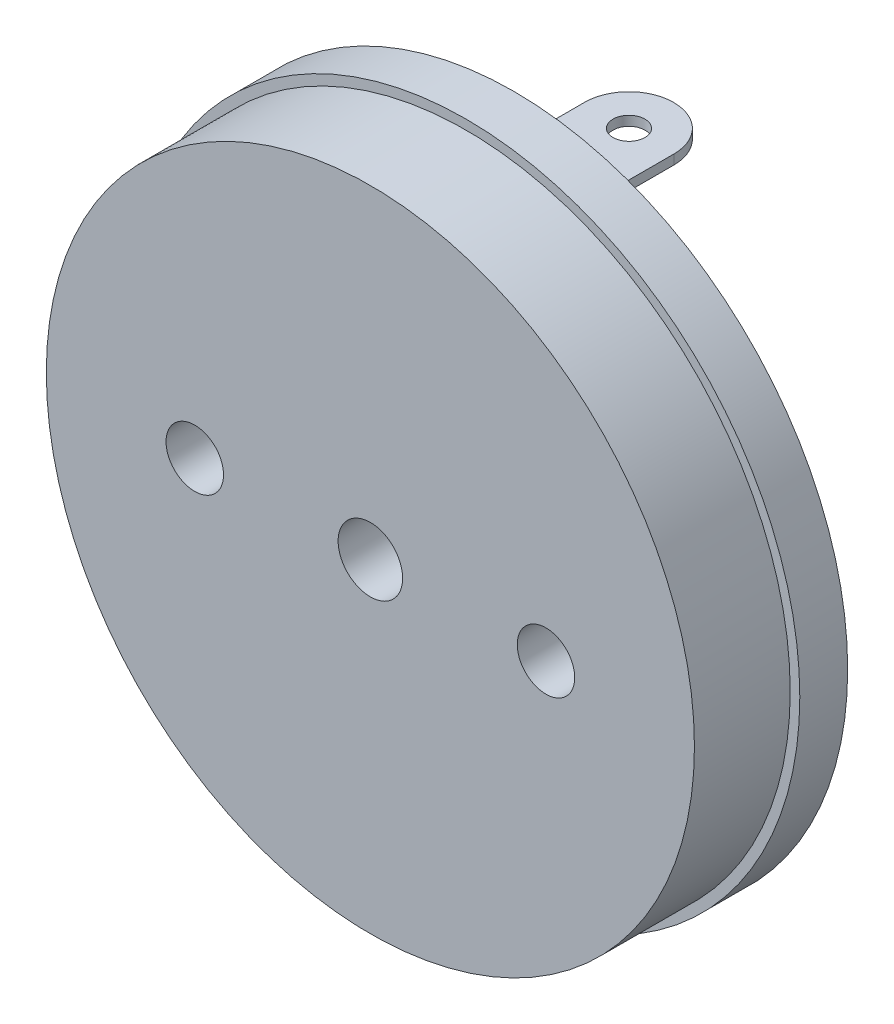
ISO-10303-21;
HEADER;
FILE_DESCRIPTION(('STEP AP214'),'2;1');
FILE_NAME('part.step','',(''),(''),'','','');
FILE_SCHEMA(('AUTOMOTIVE_DESIGN { 1 0 10303 214 1 1 1 1 }'));
ENDSEC;
DATA;
#1=APPLICATION_CONTEXT('core data for automotive mechanical design processes');
#2=APPLICATION_PROTOCOL_DEFINITION('international standard','automotive_design',2000,#1);
#3=PRODUCT_CONTEXT('',#1,'mechanical');
#4=PRODUCT('Part','Part','',(#3));
#5=PRODUCT_RELATED_PRODUCT_CATEGORY('part','',(#4));
#6=PRODUCT_DEFINITION_FORMATION('','',#4);
#7=PRODUCT_DEFINITION_CONTEXT('part definition',#1,'design');
#8=PRODUCT_DEFINITION('design','',#6,#7);
#9=PRODUCT_DEFINITION_SHAPE('','',#8);
#10=(LENGTH_UNIT() NAMED_UNIT(*) SI_UNIT(.MILLI.,.METRE.));
#11=(NAMED_UNIT(*) PLANE_ANGLE_UNIT() SI_UNIT($,.RADIAN.));
#12=(NAMED_UNIT(*) SI_UNIT($,.STERADIAN.) SOLID_ANGLE_UNIT());
#13=UNCERTAINTY_MEASURE_WITH_UNIT(LENGTH_MEASURE(1.E-05),#10,'distance_accuracy_value','');
#14=(GEOMETRIC_REPRESENTATION_CONTEXT(3) GLOBAL_UNCERTAINTY_ASSIGNED_CONTEXT((#13)) GLOBAL_UNIT_ASSIGNED_CONTEXT((#10,
#11,#12)) REPRESENTATION_CONTEXT('',''));
#15=CARTESIAN_POINT('',(0.,0.,0.));
#16=DIRECTION('',(0.,0.,1.));
#17=DIRECTION('',(1.,0.,0.));
#18=AXIS2_PLACEMENT_3D('',#15,#16,#17);
#19=CARTESIAN_POINT('',(0.,0.,0.));
#20=DIRECTION('',(0.,0.,1.));
#21=DIRECTION('',(1.,0.,0.));
#22=AXIS2_PLACEMENT_3D('',#19,#20,#21);
#23=PLANE('',#22);
#24=DIRECTION('',(1.,0.,0.));
#25=VECTOR('',#24,1.);
#26=CARTESIAN_POINT('',(2.81635245106834,-5.66058957987012,0.));
#27=LINE('',#26,#25);
#28=CARTESIAN_POINT('',(2.81635245106833,-5.66058957987012,0.));
#29=VERTEX_POINT('',#28);
#30=CARTESIAN_POINT('',(4.93558795880297,-5.66058957987012,0.));
#31=VERTEX_POINT('',#30);
#32=EDGE_CURVE('E179',#29,#31,#27,.T.);
#33=ORIENTED_EDGE('',*,*,#32,.F.);
#34=DIRECTION('',(0.,1.,0.));
#35=VECTOR('',#34,1.);
#36=CARTESIAN_POINT('',(2.81635245106834,-7.91924847627147,0.));
#37=LINE('',#36,#35);
#38=CARTESIAN_POINT('',(2.81635245106834,-7.91924847627147,0.));
#39=VERTEX_POINT('',#38);
#40=EDGE_CURVE('E55',#39,#29,#37,.T.);
#41=ORIENTED_EDGE('',*,*,#40,.F.);
#42=DIRECTION('',(-1.,0.,0.));
#43=VECTOR('',#42,1.);
#44=CARTESIAN_POINT('',(2.81635245106834,-7.91924847627147,0.));
#45=LINE('',#44,#43);
#46=CARTESIAN_POINT('',(4.93558795880296,-7.91924847627148,0.));
#47=VERTEX_POINT('',#46);
#48=EDGE_CURVE('E185',#47,#39,#45,.T.);
#49=ORIENTED_EDGE('',*,*,#48,.F.);
#50=DIRECTION('',(0.,-1.,0.));
#51=VECTOR('',#50,1.);
#52=CARTESIAN_POINT('',(4.93558795880296,-7.91924847627148,0.));
#53=LINE('',#52,#51);
#54=EDGE_CURVE('E168',#31,#47,#53,.T.);
#55=ORIENTED_EDGE('',*,*,#54,.F.);
#56=EDGE_LOOP('',(#33,#41,#49,#55));
#57=FACE_BOUND('',#56,.T.);
#58=CARTESIAN_POINT('',(-3.62500810533549,7.08270814427097,0.));
#59=DIRECTION('',(0.,0.,-1.));
#60=DIRECTION('',(-1.,0.,0.));
#61=AXIS2_PLACEMENT_3D('',#58,#59,#60);
#62=CIRCLE('',#61,1.1292433811009);
#63=CARTESIAN_POINT('',(-4.75425148643639,7.08270814427097,0.));
#64=VERTEX_POINT('',#63);
#65=EDGE_CURVE('E201',#64,#64,#62,.T.);
#66=ORIENTED_EDGE('',*,*,#65,.F.);
#67=EDGE_LOOP('',(#66));
#68=FACE_BOUND('',#67,.T.);
#69=DIRECTION('',(-1.,0.,0.));
#70=VECTOR('',#69,1.);
#71=CARTESIAN_POINT('',(1.4,-7.65,0.));
#72=LINE('',#71,#70);
#73=CARTESIAN_POINT('',(1.4,-7.65,0.));
#74=VERTEX_POINT('',#73);
#75=CARTESIAN_POINT('',(-1.4,-7.65,0.));
#76=VERTEX_POINT('',#75);
#77=EDGE_CURVE('E247',#74,#76,#72,.T.);
#78=ORIENTED_EDGE('',*,*,#77,.F.);
#79=DIRECTION('',(0.,-1.,0.));
#80=VECTOR('',#79,1.);
#81=CARTESIAN_POINT('',(1.4,-7.65,0.));
#82=LINE('',#81,#80);
#83=CARTESIAN_POINT('',(1.4,-7.35,0.));
#84=VERTEX_POINT('',#83);
#85=EDGE_CURVE('E256',#84,#74,#82,.T.);
#86=ORIENTED_EDGE('',*,*,#85,.F.);
#87=DIRECTION('',(1.,0.,0.));
#88=VECTOR('',#87,1.);
#89=CARTESIAN_POINT('',(1.4,-7.35,0.));
#90=LINE('',#89,#88);
#91=CARTESIAN_POINT('',(-1.4,-7.35,0.));
#92=VERTEX_POINT('',#91);
#93=EDGE_CURVE('E253',#92,#84,#90,.T.);
#94=ORIENTED_EDGE('',*,*,#93,.F.);
#95=DIRECTION('',(0.,1.,0.));
#96=VECTOR('',#95,1.);
#97=CARTESIAN_POINT('',(-1.4,-7.65,0.));
#98=LINE('',#97,#96);
#99=EDGE_CURVE('E250',#76,#92,#98,.T.);
#100=ORIENTED_EDGE('',*,*,#99,.F.);
#101=EDGE_LOOP('',(#78,#86,#94,#100));
#102=FACE_BOUND('',#101,.T.);
#103=CARTESIAN_POINT('',(0.,0.,0.));
#104=DIRECTION('',(0.,0.,1.));
#105=DIRECTION('',(1.,0.,0.));
#106=AXIS2_PLACEMENT_3D('',#103,#104,#105);
#107=CIRCLE('',#106,10.45);
#108=CARTESIAN_POINT('',(10.45,0.,0.));
#109=VERTEX_POINT('',#108);
#110=EDGE_CURVE('E314',#109,#109,#107,.T.);
#111=ORIENTED_EDGE('',*,*,#110,.F.);
#112=EDGE_LOOP('',(#111));
#113=FACE_BOUND('',#112,.T.);
#114=CARTESIAN_POINT('',(-5.5,0.,0.));
#115=DIRECTION('',(0.,0.,1.));
#116=DIRECTION('',(1.,0.,0.));
#117=AXIS2_PLACEMENT_3D('',#114,#115,#116);
#118=CIRCLE('',#117,0.899999999999999);
#119=CARTESIAN_POINT('',(-4.6,0.,0.));
#120=VERTEX_POINT('',#119);
#121=EDGE_CURVE('E305',#120,#120,#118,.T.);
#122=ORIENTED_EDGE('',*,*,#121,.T.);
#123=EDGE_LOOP('',(#122));
#124=FACE_BOUND('',#123,.T.);
#125=CARTESIAN_POINT('',(5.5,0.,0.));
#126=DIRECTION('',(0.,0.,1.));
#127=DIRECTION('',(-1.,0.,0.));
#128=AXIS2_PLACEMENT_3D('',#125,#126,#127);
#129=CIRCLE('',#128,0.899999999999999);
#130=CARTESIAN_POINT('',(4.6,0.,0.));
#131=VERTEX_POINT('',#130);
#132=EDGE_CURVE('E299',#131,#131,#129,.T.);
#133=ORIENTED_EDGE('',*,*,#132,.T.);
#134=EDGE_LOOP('',(#133));
#135=FACE_BOUND('',#134,.T.);
#136=CARTESIAN_POINT('',(0.,0.,0.));
#137=DIRECTION('',(0.,0.,-1.));
#138=DIRECTION('',(-1.,0.,0.));
#139=AXIS2_PLACEMENT_3D('',#136,#137,#138);
#140=CIRCLE('',#139,3.08);
#141=CARTESIAN_POINT('',(-2.3279941084415,2.01664162187079,0.));
#142=VERTEX_POINT('',#141);
#143=CARTESIAN_POINT('',(-2.3279941084415,-2.01664162187079,0.));
#144=VERTEX_POINT('',#143);
#145=EDGE_CURVE('E279',#142,#144,#140,.T.);
#146=ORIENTED_EDGE('',*,*,#145,.F.);
#147=DIRECTION('',(0.,1.,0.));
#148=VECTOR('',#147,1.);
#149=CARTESIAN_POINT('',(-2.3279941084415,2.01664162187079,0.));
#150=LINE('',#149,#148);
#151=EDGE_CURVE('E282',#144,#142,#150,.T.);
#152=ORIENTED_EDGE('',*,*,#151,.F.);
#153=EDGE_LOOP('',(#146,#152));
#154=FACE_BOUND('',#153,.T.);
#155=DIRECTION('',(0.,-1.,0.));
#156=VECTOR('',#155,1.);
#157=CARTESIAN_POINT('',(1.4,7.65,0.));
#158=LINE('',#157,#156);
#159=CARTESIAN_POINT('',(1.4,7.65,0.));
#160=VERTEX_POINT('',#159);
#161=CARTESIAN_POINT('',(1.4,7.35,0.));
#162=VERTEX_POINT('',#161);
#163=EDGE_CURVE('E221',#160,#162,#158,.T.);
#164=ORIENTED_EDGE('',*,*,#163,.F.);
#165=DIRECTION('',(1.,0.,0.));
#166=VECTOR('',#165,1.);
#167=CARTESIAN_POINT('',(1.4,7.65,0.));
#168=LINE('',#167,#166);
#169=CARTESIAN_POINT('',(-1.4,7.65,0.));
#170=VERTEX_POINT('',#169);
#171=EDGE_CURVE('E230',#170,#160,#168,.T.);
#172=ORIENTED_EDGE('',*,*,#171,.F.);
#173=DIRECTION('',(0.,1.,0.));
#174=VECTOR('',#173,1.);
#175=CARTESIAN_POINT('',(-1.4,7.65,0.));
#176=LINE('',#175,#174);
#177=CARTESIAN_POINT('',(-1.4,7.35,0.));
#178=VERTEX_POINT('',#177);
#179=EDGE_CURVE('E227',#178,#170,#176,.T.);
#180=ORIENTED_EDGE('',*,*,#179,.F.);
#181=DIRECTION('',(-1.,0.,0.));
#182=VECTOR('',#181,1.);
#183=CARTESIAN_POINT('',(1.4,7.35,0.));
#184=LINE('',#183,#182);
#185=EDGE_CURVE('E224',#162,#178,#184,.T.);
#186=ORIENTED_EDGE('',*,*,#185,.F.);
#187=EDGE_LOOP('',(#164,#172,#180,#186));
#188=FACE_BOUND('',#187,.T.);
#189=ADVANCED_FACE('F40',(#57,#68,#102,#113,#124,#135,#154,#188),#23,.F.);
#190=CARTESIAN_POINT('',(0.,0.,1.5));
#191=DIRECTION('',(0.,0.,1.));
#192=DIRECTION('',(1.,0.,0.));
#193=AXIS2_PLACEMENT_3D('',#190,#191,#192);
#194=PLANE('',#193);
#195=CARTESIAN_POINT('',(0.,0.,1.5));
#196=DIRECTION('',(0.,0.,1.));
#197=DIRECTION('',(1.,0.,0.));
#198=AXIS2_PLACEMENT_3D('',#195,#196,#197);
#199=CIRCLE('',#198,10.45);
#200=CARTESIAN_POINT('',(10.45,0.,1.5));
#201=VERTEX_POINT('',#200);
#202=EDGE_CURVE('E317',#201,#201,#199,.T.);
#203=ORIENTED_EDGE('',*,*,#202,.T.);
#204=EDGE_LOOP('',(#203));
#205=FACE_BOUND('',#204,.T.);
#206=CARTESIAN_POINT('',(0.,0.,1.5));
#207=DIRECTION('',(0.,0.,1.));
#208=DIRECTION('',(1.,0.,0.));
#209=AXIS2_PLACEMENT_3D('',#206,#207,#208);
#210=CIRCLE('',#209,10.15);
#211=CARTESIAN_POINT('',(10.15,0.,1.5));
#212=VERTEX_POINT('',#211);
#213=EDGE_CURVE('E308',#212,#212,#210,.T.);
#214=ORIENTED_EDGE('',*,*,#213,.F.);
#215=EDGE_LOOP('',(#214));
#216=FACE_BOUND('',#215,.T.);
#217=ADVANCED_FACE('F392',(#205,#216),#194,.T.);
#218=CARTESIAN_POINT('',(0.,0.,1.5));
#219=DIRECTION('',(0.,0.,-1.));
#220=DIRECTION('',(-1.,0.,0.));
#221=AXIS2_PLACEMENT_3D('',#218,#219,#220);
#222=CYLINDRICAL_SURFACE('',#221,10.45);
#223=ORIENTED_EDGE('',*,*,#202,.F.);
#224=EDGE_LOOP('',(#223));
#225=FACE_BOUND('',#224,.T.);
#226=ORIENTED_EDGE('',*,*,#110,.T.);
#227=EDGE_LOOP('',(#226));
#228=FACE_BOUND('',#227,.T.);
#229=ADVANCED_FACE('F42',(#225,#228),#222,.T.);
#230=CARTESIAN_POINT('',(0.,0.,4.5));
#231=DIRECTION('',(0.,0.,-1.));
#232=DIRECTION('',(-1.,0.,0.));
#233=AXIS2_PLACEMENT_3D('',#230,#231,#232);
#234=CYLINDRICAL_SURFACE('',#233,10.15);
#235=CARTESIAN_POINT('',(0.,0.,4.5));
#236=DIRECTION('',(0.,0.,1.));
#237=DIRECTION('',(1.,0.,0.));
#238=AXIS2_PLACEMENT_3D('',#235,#236,#237);
#239=CIRCLE('',#238,10.15);
#240=CARTESIAN_POINT('',(10.15,0.,4.5));
#241=VERTEX_POINT('',#240);
#242=EDGE_CURVE('E311',#241,#241,#239,.T.);
#243=ORIENTED_EDGE('',*,*,#242,.F.);
#244=EDGE_LOOP('',(#243));
#245=FACE_BOUND('',#244,.T.);
#246=ORIENTED_EDGE('',*,*,#213,.T.);
#247=EDGE_LOOP('',(#246));
#248=FACE_BOUND('',#247,.T.);
#249=ADVANCED_FACE('F399',(#245,#248),#234,.T.);
#250=CARTESIAN_POINT('',(0.,0.,4.5));
#251=DIRECTION('',(0.,0.,1.));
#252=DIRECTION('',(1.,0.,0.));
#253=AXIS2_PLACEMENT_3D('',#250,#251,#252);
#254=PLANE('',#253);
#255=CARTESIAN_POINT('',(0.,0.,4.5));
#256=DIRECTION('',(0.,0.,1.));
#257=DIRECTION('',(1.,0.,0.));
#258=AXIS2_PLACEMENT_3D('',#255,#256,#257);
#259=CIRCLE('',#258,1.01);
#260=CARTESIAN_POINT('',(1.01,0.,4.5));
#261=VERTEX_POINT('',#260);
#262=EDGE_CURVE('E273',#261,#261,#259,.T.);
#263=ORIENTED_EDGE('',*,*,#262,.F.);
#264=EDGE_LOOP('',(#263));
#265=FACE_BOUND('',#264,.T.);
#266=CARTESIAN_POINT('',(5.5,0.,4.5));
#267=DIRECTION('',(0.,0.,1.));
#268=DIRECTION('',(-1.,0.,0.));
#269=AXIS2_PLACEMENT_3D('',#266,#267,#268);
#270=CIRCLE('',#269,0.899999999999999);
#271=CARTESIAN_POINT('',(4.6,0.,4.5));
#272=VERTEX_POINT('',#271);
#273=EDGE_CURVE('E296',#272,#272,#270,.T.);
#274=ORIENTED_EDGE('',*,*,#273,.F.);
#275=EDGE_LOOP('',(#274));
#276=FACE_BOUND('',#275,.T.);
#277=CARTESIAN_POINT('',(-5.5,0.,4.5));
#278=DIRECTION('',(0.,0.,1.));
#279=DIRECTION('',(1.,0.,0.));
#280=AXIS2_PLACEMENT_3D('',#277,#278,#279);
#281=CIRCLE('',#280,0.899999999999999);
#282=CARTESIAN_POINT('',(-4.6,0.,4.5));
#283=VERTEX_POINT('',#282);
#284=EDGE_CURVE('E302',#283,#283,#281,.T.);
#285=ORIENTED_EDGE('',*,*,#284,.F.);
#286=EDGE_LOOP('',(#285));
#287=FACE_BOUND('',#286,.T.);
#288=ORIENTED_EDGE('',*,*,#242,.T.);
#289=EDGE_LOOP('',(#288));
#290=FACE_BOUND('',#289,.T.);
#291=ADVANCED_FACE('F402',(#265,#276,#287,#290),#254,.T.);
#292=CARTESIAN_POINT('',(-5.5,0.,0.));
#293=DIRECTION('',(0.,0.,1.));
#294=DIRECTION('',(1.,0.,0.));
#295=AXIS2_PLACEMENT_3D('',#292,#293,#294);
#296=CYLINDRICAL_SURFACE('',#295,0.899999999999999);
#297=ORIENTED_EDGE('',*,*,#121,.F.);
#298=EDGE_LOOP('',(#297));
#299=FACE_BOUND('',#298,.T.);
#300=ORIENTED_EDGE('',*,*,#284,.T.);
#301=EDGE_LOOP('',(#300));
#302=FACE_BOUND('',#301,.T.);
#303=ADVANCED_FACE('F406',(#299,#302),#296,.F.);
#304=CARTESIAN_POINT('',(5.5,0.,0.));
#305=DIRECTION('',(0.,0.,1.));
#306=DIRECTION('',(1.,0.,0.));
#307=AXIS2_PLACEMENT_3D('',#304,#305,#306);
#308=CYLINDRICAL_SURFACE('',#307,0.899999999999999);
#309=ORIENTED_EDGE('',*,*,#132,.F.);
#310=EDGE_LOOP('',(#309));
#311=FACE_BOUND('',#310,.T.);
#312=ORIENTED_EDGE('',*,*,#273,.T.);
#313=EDGE_LOOP('',(#312));
#314=FACE_BOUND('',#313,.T.);
#315=ADVANCED_FACE('F410',(#311,#314),#308,.F.);
#316=CARTESIAN_POINT('',(0.,0.,-2.));
#317=DIRECTION('',(0.,0.,1.));
#318=DIRECTION('',(1.,0.,0.));
#319=AXIS2_PLACEMENT_3D('',#316,#317,#318);
#320=CYLINDRICAL_SURFACE('',#319,3.08);
#321=ORIENTED_EDGE('',*,*,#145,.T.);
#322=DIRECTION('',(0.,0.,1.));
#323=VECTOR('',#322,1.);
#324=CARTESIAN_POINT('',(-2.3279941084415,-2.01664162187083,-2.));
#325=LINE('',#324,#323);
#326=CARTESIAN_POINT('',(-2.3279941084415,-2.01664162187083,-2.));
#327=VERTEX_POINT('',#326);
#328=EDGE_CURVE('E293',#327,#144,#325,.T.);
#329=ORIENTED_EDGE('',*,*,#328,.F.);
#330=CARTESIAN_POINT('',(0.,0.,-2.));
#331=DIRECTION('',(0.,0.,-1.));
#332=DIRECTION('',(-1.,0.,0.));
#333=AXIS2_PLACEMENT_3D('',#330,#331,#332);
#334=CIRCLE('',#333,3.08);
#335=CARTESIAN_POINT('',(-2.3279941084415,2.01664162187076,-2.));
#336=VERTEX_POINT('',#335);
#337=EDGE_CURVE('E285',#336,#327,#334,.T.);
#338=ORIENTED_EDGE('',*,*,#337,.F.);
#339=DIRECTION('',(0.,0.,1.));
#340=VECTOR('',#339,1.);
#341=CARTESIAN_POINT('',(-2.3279941084415,2.01664162187076,-2.));
#342=LINE('',#341,#340);
#343=EDGE_CURVE('E290',#336,#142,#342,.T.);
#344=ORIENTED_EDGE('',*,*,#343,.T.);
#345=EDGE_LOOP('',(#321,#329,#338,#344));
#346=FACE_BOUND('',#345,.T.);
#347=ADVANCED_FACE('F414',(#346),#320,.T.);
#348=CARTESIAN_POINT('',(-2.3279941084415,2.01664162187076,-2.));
#349=DIRECTION('',(1.,0.,0.));
#350=DIRECTION('',(0.,1.,0.));
#351=AXIS2_PLACEMENT_3D('',#348,#349,#350);
#352=PLANE('',#351);
#353=ORIENTED_EDGE('',*,*,#151,.T.);
#354=ORIENTED_EDGE('',*,*,#343,.F.);
#355=DIRECTION('',(0.,1.,0.));
#356=VECTOR('',#355,1.);
#357=CARTESIAN_POINT('',(-2.3279941084415,2.01664162187076,-2.));
#358=LINE('',#357,#356);
#359=EDGE_CURVE('E288',#327,#336,#358,.T.);
#360=ORIENTED_EDGE('',*,*,#359,.F.);
#361=ORIENTED_EDGE('',*,*,#328,.T.);
#362=EDGE_LOOP('',(#353,#354,#360,#361));
#363=FACE_BOUND('',#362,.T.);
#364=ADVANCED_FACE('F418',(#363),#352,.F.);
#365=CARTESIAN_POINT('',(0.,0.,-2.));
#366=DIRECTION('',(0.,0.,-1.));
#367=DIRECTION('',(-1.,0.,0.));
#368=AXIS2_PLACEMENT_3D('',#365,#366,#367);
#369=PLANE('',#368);
#370=CARTESIAN_POINT('',(0.,0.,-2.));
#371=DIRECTION('',(0.,0.,1.));
#372=DIRECTION('',(1.,0.,0.));
#373=AXIS2_PLACEMENT_3D('',#370,#371,#372);
#374=CIRCLE('',#373,1.01);
#375=CARTESIAN_POINT('',(1.01,0.,-2.));
#376=VERTEX_POINT('',#375);
#377=EDGE_CURVE('E276',#376,#376,#374,.T.);
#378=ORIENTED_EDGE('',*,*,#377,.T.);
#379=EDGE_LOOP('',(#378));
#380=FACE_BOUND('',#379,.T.);
#381=ORIENTED_EDGE('',*,*,#337,.T.);
#382=ORIENTED_EDGE('',*,*,#359,.T.);
#383=EDGE_LOOP('',(#381,#382));
#384=FACE_BOUND('',#383,.T.);
#385=ADVANCED_FACE('F422',(#380,#384),#369,.T.);
#386=CARTESIAN_POINT('',(0.,0.,-2.));
#387=DIRECTION('',(0.,0.,1.));
#388=DIRECTION('',(1.,0.,0.));
#389=AXIS2_PLACEMENT_3D('',#386,#387,#388);
#390=CYLINDRICAL_SURFACE('',#389,1.01);
#391=ORIENTED_EDGE('',*,*,#377,.F.);
#392=EDGE_LOOP('',(#391));
#393=FACE_BOUND('',#392,.T.);
#394=ORIENTED_EDGE('',*,*,#262,.T.);
#395=EDGE_LOOP('',(#394));
#396=FACE_BOUND('',#395,.T.);
#397=ADVANCED_FACE('F426',(#393,#396),#390,.F.);
#398=CARTESIAN_POINT('',(1.4,-7.65,-5.));
#399=DIRECTION('',(0.,1.,0.));
#400=DIRECTION('',(0.,0.,1.));
#401=AXIS2_PLACEMENT_3D('',#398,#399,#400);
#402=PLANE('',#401);
#403=CARTESIAN_POINT('',(0.,-7.65,-3.6));
#404=DIRECTION('',(0.,1.,0.));
#405=DIRECTION('',(0.,0.,1.));
#406=AXIS2_PLACEMENT_3D('',#403,#404,#405);
#407=CIRCLE('',#406,0.5);
#408=CARTESIAN_POINT('',(0.,-7.65,-3.1));
#409=VERTEX_POINT('',#408);
#410=EDGE_CURVE('E218',#409,#409,#407,.T.);
#411=ORIENTED_EDGE('',*,*,#410,.T.);
#412=EDGE_LOOP('',(#411));
#413=FACE_BOUND('',#412,.T.);
#414=DIRECTION('',(0.,0.,1.));
#415=VECTOR('',#414,1.);
#416=CARTESIAN_POINT('',(-1.4,-7.65,-5.));
#417=LINE('',#416,#415);
#418=CARTESIAN_POINT('',(-1.4,-7.64999999999999,-3.60999999999999));
#419=VERTEX_POINT('',#418);
#420=EDGE_CURVE('E271',#419,#76,#417,.T.);
#421=ORIENTED_EDGE('',*,*,#420,.F.);
#422=CARTESIAN_POINT('',(-0.0100000000000005,-7.65,-3.61));
#423=DIRECTION('',(0.,1.,0.));
#424=DIRECTION('',(0.,0.,1.));
#425=AXIS2_PLACEMENT_3D('',#422,#423,#424);
#426=CIRCLE('',#425,1.39);
#427=CARTESIAN_POINT('',(-0.0100000000000005,-7.65,-5.));
#428=VERTEX_POINT('',#427);
#429=EDGE_CURVE('E48',#419,#428,#426,.F.);
#430=ORIENTED_EDGE('',*,*,#429,.T.);
#431=DIRECTION('',(-1.,0.,0.));
#432=VECTOR('',#431,1.);
#433=CARTESIAN_POINT('',(1.4,-7.65,-5.));
#434=LINE('',#433,#432);
#435=CARTESIAN_POINT('',(0.01,-7.65,-5.));
#436=VERTEX_POINT('',#435);
#437=EDGE_CURVE('E259',#436,#428,#434,.T.);
#438=ORIENTED_EDGE('',*,*,#437,.F.);
#439=CARTESIAN_POINT('',(0.01,-7.65,-3.61));
#440=DIRECTION('',(0.,1.,0.));
#441=DIRECTION('',(0.,0.,1.));
#442=AXIS2_PLACEMENT_3D('',#439,#440,#441);
#443=CIRCLE('',#442,1.39);
#444=CARTESIAN_POINT('',(1.4,-7.65,-3.61));
#445=VERTEX_POINT('',#444);
#446=EDGE_CURVE('E63',#436,#445,#443,.F.);
#447=ORIENTED_EDGE('',*,*,#446,.T.);
#448=DIRECTION('',(0.,0.,1.));
#449=VECTOR('',#448,1.);
#450=CARTESIAN_POINT('',(1.4,-7.65,-5.));
#451=LINE('',#450,#449);
#452=EDGE_CURVE('E265',#445,#74,#451,.T.);
#453=ORIENTED_EDGE('',*,*,#452,.T.);
#454=ORIENTED_EDGE('',*,*,#77,.T.);
#455=EDGE_LOOP('',(#421,#430,#438,#447,#453,#454));
#456=FACE_BOUND('',#455,.T.);
#457=ADVANCED_FACE('F352',(#413,#456),#402,.F.);
#458=CARTESIAN_POINT('',(-1.4,-7.65,-5.));
#459=DIRECTION('',(1.,0.,0.));
#460=DIRECTION('',(0.,0.,-1.));
#461=AXIS2_PLACEMENT_3D('',#458,#459,#460);
#462=PLANE('',#461);
#463=DIRECTION('',(0.,0.,1.));
#464=VECTOR('',#463,1.);
#465=CARTESIAN_POINT('',(-1.4,-7.35,-5.));
#466=LINE('',#465,#464);
#467=CARTESIAN_POINT('',(-1.4,-7.35,-3.61));
#468=VERTEX_POINT('',#467);
#469=EDGE_CURVE('E269',#468,#92,#466,.T.);
#470=ORIENTED_EDGE('',*,*,#469,.F.);
#471=DIRECTION('',(0.,1.,0.));
#472=VECTOR('',#471,1.);
#473=CARTESIAN_POINT('',(-1.4,-7.64999999999999,-3.60999999999999));
#474=LINE('',#473,#472);
#475=EDGE_CURVE('E348',#468,#419,#474,.F.);
#476=ORIENTED_EDGE('',*,*,#475,.T.);
#477=ORIENTED_EDGE('',*,*,#420,.T.);
#478=ORIENTED_EDGE('',*,*,#99,.T.);
#479=EDGE_LOOP('',(#470,#476,#477,#478));
#480=FACE_BOUND('',#479,.T.);
#481=ADVANCED_FACE('F366',(#480),#462,.F.);
#482=CARTESIAN_POINT('',(1.4,-7.35,-5.));
#483=DIRECTION('',(0.,-1.,0.));
#484=DIRECTION('',(0.,0.,-1.));
#485=AXIS2_PLACEMENT_3D('',#482,#483,#484);
#486=PLANE('',#485);
#487=CARTESIAN_POINT('',(0.,-7.35,-3.6));
#488=DIRECTION('',(0.,-1.,0.));
#489=DIRECTION('',(0.,0.,-1.));
#490=AXIS2_PLACEMENT_3D('',#487,#488,#489);
#491=CIRCLE('',#490,0.5);
#492=CARTESIAN_POINT('',(0.,-7.35,-4.1));
#493=VERTEX_POINT('',#492);
#494=EDGE_CURVE('E215',#493,#493,#491,.T.);
#495=ORIENTED_EDGE('',*,*,#494,.T.);
#496=EDGE_LOOP('',(#495));
#497=FACE_BOUND('',#496,.T.);
#498=DIRECTION('',(1.,0.,0.));
#499=VECTOR('',#498,1.);
#500=CARTESIAN_POINT('',(1.4,-7.35,-5.));
#501=LINE('',#500,#499);
#502=CARTESIAN_POINT('',(-0.0100000000000005,-7.35,-5.));
#503=VERTEX_POINT('',#502);
#504=CARTESIAN_POINT('',(0.01,-7.35,-5.));
#505=VERTEX_POINT('',#504);
#506=EDGE_CURVE('E262',#503,#505,#501,.T.);
#507=ORIENTED_EDGE('',*,*,#506,.F.);
#508=CARTESIAN_POINT('',(-0.0100000000000005,-7.35,-3.61));
#509=DIRECTION('',(0.,-1.,0.));
#510=DIRECTION('',(0.,0.,-1.));
#511=AXIS2_PLACEMENT_3D('',#508,#509,#510);
#512=CIRCLE('',#511,1.39);
#513=EDGE_CURVE('E346',#503,#468,#512,.F.);
#514=ORIENTED_EDGE('',*,*,#513,.T.);
#515=ORIENTED_EDGE('',*,*,#469,.T.);
#516=ORIENTED_EDGE('',*,*,#93,.T.);
#517=DIRECTION('',(0.,0.,1.));
#518=VECTOR('',#517,1.);
#519=CARTESIAN_POINT('',(1.4,-7.35,-5.));
#520=LINE('',#519,#518);
#521=CARTESIAN_POINT('',(1.4,-7.35,-3.61));
#522=VERTEX_POINT('',#521);
#523=EDGE_CURVE('E267',#522,#84,#520,.T.);
#524=ORIENTED_EDGE('',*,*,#523,.F.);
#525=CARTESIAN_POINT('',(0.01,-7.35,-3.61));
#526=DIRECTION('',(0.,-1.,0.));
#527=DIRECTION('',(0.,0.,-1.));
#528=AXIS2_PLACEMENT_3D('',#525,#526,#527);
#529=CIRCLE('',#528,1.39);
#530=EDGE_CURVE('E344',#522,#505,#529,.F.);
#531=ORIENTED_EDGE('',*,*,#530,.T.);
#532=EDGE_LOOP('',(#507,#514,#515,#516,#524,#531));
#533=FACE_BOUND('',#532,.T.);
#534=ADVANCED_FACE('F363',(#497,#533),#486,.F.);
#535=CARTESIAN_POINT('',(1.4,-7.65,-5.));
#536=DIRECTION('',(-1.,0.,0.));
#537=DIRECTION('',(0.,0.,1.));
#538=AXIS2_PLACEMENT_3D('',#535,#536,#537);
#539=PLANE('',#538);
#540=ORIENTED_EDGE('',*,*,#452,.F.);
#541=DIRECTION('',(0.,-1.,0.));
#542=VECTOR('',#541,1.);
#543=CARTESIAN_POINT('',(1.4,-7.35,-3.61));
#544=LINE('',#543,#542);
#545=EDGE_CURVE('E11',#445,#522,#544,.F.);
#546=ORIENTED_EDGE('',*,*,#545,.T.);
#547=ORIENTED_EDGE('',*,*,#523,.T.);
#548=ORIENTED_EDGE('',*,*,#85,.T.);
#549=EDGE_LOOP('',(#540,#546,#547,#548));
#550=FACE_BOUND('',#549,.T.);
#551=ADVANCED_FACE('F374',(#550),#539,.F.);
#552=CARTESIAN_POINT('',(-1.4,-7.65,-5.));
#553=DIRECTION('',(0.,0.,-1.));
#554=DIRECTION('',(-1.,0.,0.));
#555=AXIS2_PLACEMENT_3D('',#552,#553,#554);
#556=PLANE('',#555);
#557=ORIENTED_EDGE('',*,*,#437,.T.);
#558=DIRECTION('',(0.,1.,0.));
#559=VECTOR('',#558,1.);
#560=CARTESIAN_POINT('',(-0.0100000000000005,-7.35,-5.));
#561=LINE('',#560,#559);
#562=EDGE_CURVE('E341',#428,#503,#561,.T.);
#563=ORIENTED_EDGE('',*,*,#562,.T.);
#564=ORIENTED_EDGE('',*,*,#506,.T.);
#565=DIRECTION('',(0.,-1.,0.));
#566=VECTOR('',#565,1.);
#567=CARTESIAN_POINT('',(0.01,-7.65,-5.));
#568=LINE('',#567,#566);
#569=EDGE_CURVE('E338',#505,#436,#568,.T.);
#570=ORIENTED_EDGE('',*,*,#569,.T.);
#571=EDGE_LOOP('',(#557,#563,#564,#570));
#572=FACE_BOUND('',#571,.T.);
#573=ADVANCED_FACE('F357',(#572),#556,.T.);
#574=CARTESIAN_POINT('',(1.4,7.65,-5.));
#575=DIRECTION('',(-1.,0.,0.));
#576=DIRECTION('',(0.,0.,1.));
#577=AXIS2_PLACEMENT_3D('',#574,#575,#576);
#578=PLANE('',#577);
#579=DIRECTION('',(0.,0.,1.));
#580=VECTOR('',#579,1.);
#581=CARTESIAN_POINT('',(1.4,7.35,-5.));
#582=LINE('',#581,#580);
#583=CARTESIAN_POINT('',(1.4,7.35,-3.61));
#584=VERTEX_POINT('',#583);
#585=EDGE_CURVE('E245',#584,#162,#582,.T.);
#586=ORIENTED_EDGE('',*,*,#585,.F.);
#587=DIRECTION('',(0.,-1.,0.));
#588=VECTOR('',#587,1.);
#589=CARTESIAN_POINT('',(1.4,7.65,-3.61));
#590=LINE('',#589,#588);
#591=CARTESIAN_POINT('',(1.4,7.65,-3.61));
#592=VERTEX_POINT('',#591);
#593=EDGE_CURVE('E330',#584,#592,#590,.F.);
#594=ORIENTED_EDGE('',*,*,#593,.T.);
#595=DIRECTION('',(0.,0.,1.));
#596=VECTOR('',#595,1.);
#597=CARTESIAN_POINT('',(1.4,7.65,-5.));
#598=LINE('',#597,#596);
#599=EDGE_CURVE('E239',#592,#160,#598,.T.);
#600=ORIENTED_EDGE('',*,*,#599,.T.);
#601=ORIENTED_EDGE('',*,*,#163,.T.);
#602=EDGE_LOOP('',(#586,#594,#600,#601));
#603=FACE_BOUND('',#602,.T.);
#604=ADVANCED_FACE('F443',(#603),#578,.F.);
#605=CARTESIAN_POINT('',(1.4,7.35,-5.));
#606=DIRECTION('',(0.,1.,0.));
#607=DIRECTION('',(0.,0.,1.));
#608=AXIS2_PLACEMENT_3D('',#605,#606,#607);
#609=PLANE('',#608);
#610=CARTESIAN_POINT('',(0.,7.35,-3.6));
#611=DIRECTION('',(0.,1.,0.));
#612=DIRECTION('',(0.,0.,1.));
#613=AXIS2_PLACEMENT_3D('',#610,#611,#612);
#614=CIRCLE('',#613,0.5);
#615=CARTESIAN_POINT('',(0.,7.35,-3.1));
#616=VERTEX_POINT('',#615);
#617=EDGE_CURVE('E212',#616,#616,#614,.T.);
#618=ORIENTED_EDGE('',*,*,#617,.T.);
#619=EDGE_LOOP('',(#618));
#620=FACE_BOUND('',#619,.T.);
#621=DIRECTION('',(-1.,0.,0.));
#622=VECTOR('',#621,1.);
#623=CARTESIAN_POINT('',(1.4,7.35,-5.));
#624=LINE('',#623,#622);
#625=CARTESIAN_POINT('',(0.01,7.35,-5.));
#626=VERTEX_POINT('',#625);
#627=CARTESIAN_POINT('',(-0.0100000000000005,7.35,-5.));
#628=VERTEX_POINT('',#627);
#629=EDGE_CURVE('E233',#626,#628,#624,.T.);
#630=ORIENTED_EDGE('',*,*,#629,.F.);
#631=CARTESIAN_POINT('',(0.01,7.35,-3.61));
#632=DIRECTION('',(0.,1.,0.));
#633=DIRECTION('',(0.,0.,1.));
#634=AXIS2_PLACEMENT_3D('',#631,#632,#633);
#635=CIRCLE('',#634,1.39);
#636=EDGE_CURVE('E328',#626,#584,#635,.F.);
#637=ORIENTED_EDGE('',*,*,#636,.T.);
#638=ORIENTED_EDGE('',*,*,#585,.T.);
#639=ORIENTED_EDGE('',*,*,#185,.T.);
#640=DIRECTION('',(0.,0.,1.));
#641=VECTOR('',#640,1.);
#642=CARTESIAN_POINT('',(-1.4,7.35,-5.));
#643=LINE('',#642,#641);
#644=CARTESIAN_POINT('',(-1.4,7.35000000000001,-3.61));
#645=VERTEX_POINT('',#644);
#646=EDGE_CURVE('E243',#645,#178,#643,.T.);
#647=ORIENTED_EDGE('',*,*,#646,.F.);
#648=CARTESIAN_POINT('',(-0.0100000000000005,7.35,-3.61));
#649=DIRECTION('',(0.,1.,0.));
#650=DIRECTION('',(0.,0.,1.));
#651=AXIS2_PLACEMENT_3D('',#648,#649,#650);
#652=CIRCLE('',#651,1.39);
#653=EDGE_CURVE('E326',#645,#628,#652,.F.);
#654=ORIENTED_EDGE('',*,*,#653,.T.);
#655=EDGE_LOOP('',(#630,#637,#638,#639,#647,#654));
#656=FACE_BOUND('',#655,.T.);
#657=ADVANCED_FACE('F446',(#620,#656),#609,.F.);
#658=CARTESIAN_POINT('',(-1.4,7.65,-5.));
#659=DIRECTION('',(1.,0.,0.));
#660=DIRECTION('',(0.,0.,-1.));
#661=AXIS2_PLACEMENT_3D('',#658,#659,#660);
#662=PLANE('',#661);
#663=DIRECTION('',(0.,0.,1.));
#664=VECTOR('',#663,1.);
#665=CARTESIAN_POINT('',(-1.4,7.65,-5.));
#666=LINE('',#665,#664);
#667=CARTESIAN_POINT('',(-1.4,7.65,-3.60999999999999));
#668=VERTEX_POINT('',#667);
#669=EDGE_CURVE('E241',#668,#170,#666,.T.);
#670=ORIENTED_EDGE('',*,*,#669,.F.);
#671=DIRECTION('',(0.,1.,0.));
#672=VECTOR('',#671,1.);
#673=CARTESIAN_POINT('',(-1.4,7.35000000000001,-3.61));
#674=LINE('',#673,#672);
#675=EDGE_CURVE('E336',#668,#645,#674,.F.);
#676=ORIENTED_EDGE('',*,*,#675,.T.);
#677=ORIENTED_EDGE('',*,*,#646,.T.);
#678=ORIENTED_EDGE('',*,*,#179,.T.);
#679=EDGE_LOOP('',(#670,#676,#677,#678));
#680=FACE_BOUND('',#679,.T.);
#681=ADVANCED_FACE('F450',(#680),#662,.F.);
#682=CARTESIAN_POINT('',(1.4,7.65,-5.));
#683=DIRECTION('',(0.,-1.,0.));
#684=DIRECTION('',(0.,0.,-1.));
#685=AXIS2_PLACEMENT_3D('',#682,#683,#684);
#686=PLANE('',#685);
#687=CARTESIAN_POINT('',(0.,7.65,-3.6));
#688=DIRECTION('',(0.,1.,0.));
#689=DIRECTION('',(0.,0.,1.));
#690=AXIS2_PLACEMENT_3D('',#687,#688,#689);
#691=CIRCLE('',#690,0.5);
#692=CARTESIAN_POINT('',(0.,7.65,-3.1));
#693=VERTEX_POINT('',#692);
#694=EDGE_CURVE('E209',#693,#693,#691,.T.);
#695=ORIENTED_EDGE('',*,*,#694,.F.);
#696=EDGE_LOOP('',(#695));
#697=FACE_BOUND('',#696,.T.);
#698=ORIENTED_EDGE('',*,*,#599,.F.);
#699=CARTESIAN_POINT('',(0.01,7.65,-3.61));
#700=DIRECTION('',(0.,-1.,0.));
#701=DIRECTION('',(0.,0.,-1.));
#702=AXIS2_PLACEMENT_3D('',#699,#700,#701);
#703=CIRCLE('',#702,1.39);
#704=CARTESIAN_POINT('',(0.01,7.65,-5.));
#705=VERTEX_POINT('',#704);
#706=EDGE_CURVE('E334',#592,#705,#703,.F.);
#707=ORIENTED_EDGE('',*,*,#706,.T.);
#708=DIRECTION('',(1.,0.,0.));
#709=VECTOR('',#708,1.);
#710=CARTESIAN_POINT('',(1.4,7.65,-5.));
#711=LINE('',#710,#709);
#712=CARTESIAN_POINT('',(-0.0100000000000005,7.65,-5.));
#713=VERTEX_POINT('',#712);
#714=EDGE_CURVE('E236',#713,#705,#711,.T.);
#715=ORIENTED_EDGE('',*,*,#714,.F.);
#716=CARTESIAN_POINT('',(-0.0100000000000005,7.65,-3.61));
#717=DIRECTION('',(0.,-1.,0.));
#718=DIRECTION('',(0.,0.,-1.));
#719=AXIS2_PLACEMENT_3D('',#716,#717,#718);
#720=CIRCLE('',#719,1.39);
#721=EDGE_CURVE('E332',#713,#668,#720,.F.);
#722=ORIENTED_EDGE('',*,*,#721,.T.);
#723=ORIENTED_EDGE('',*,*,#669,.T.);
#724=ORIENTED_EDGE('',*,*,#171,.T.);
#725=EDGE_LOOP('',(#698,#707,#715,#722,#723,#724));
#726=FACE_BOUND('',#725,.T.);
#727=ADVANCED_FACE('F454',(#697,#726),#686,.F.);
#728=CARTESIAN_POINT('',(1.4,7.35,-5.));
#729=DIRECTION('',(0.,0.,-1.));
#730=DIRECTION('',(-1.,0.,0.));
#731=AXIS2_PLACEMENT_3D('',#728,#729,#730);
#732=PLANE('',#731);
#733=ORIENTED_EDGE('',*,*,#714,.T.);
#734=DIRECTION('',(0.,-1.,0.));
#735=VECTOR('',#734,1.);
#736=CARTESIAN_POINT('',(0.01,7.35,-5.));
#737=LINE('',#736,#735);
#738=EDGE_CURVE('E323',#705,#626,#737,.T.);
#739=ORIENTED_EDGE('',*,*,#738,.T.);
#740=ORIENTED_EDGE('',*,*,#629,.T.);
#741=DIRECTION('',(0.,1.,0.));
#742=VECTOR('',#741,1.);
#743=CARTESIAN_POINT('',(-0.0100000000000005,7.65,-5.));
#744=LINE('',#743,#742);
#745=EDGE_CURVE('E320',#628,#713,#744,.T.);
#746=ORIENTED_EDGE('',*,*,#745,.T.);
#747=EDGE_LOOP('',(#733,#739,#740,#746));
#748=FACE_BOUND('',#747,.T.);
#749=ADVANCED_FACE('F458',(#748),#732,.T.);
#750=CARTESIAN_POINT('',(0.01,7.35,-3.61));
#751=DIRECTION('',(0.,1.,0.));
#752=DIRECTION('',(0.,0.,1.));
#753=AXIS2_PLACEMENT_3D('',#750,#751,#752);
#754=CYLINDRICAL_SURFACE('',#753,1.39);
#755=ORIENTED_EDGE('',*,*,#706,.F.);
#756=ORIENTED_EDGE('',*,*,#593,.F.);
#757=ORIENTED_EDGE('',*,*,#636,.F.);
#758=ORIENTED_EDGE('',*,*,#738,.F.);
#759=EDGE_LOOP('',(#755,#756,#757,#758));
#760=FACE_BOUND('',#759,.T.);
#761=ADVANCED_FACE('F462',(#760),#754,.T.);
#762=CARTESIAN_POINT('',(-0.0100000000000005,7.35,-3.61));
#763=DIRECTION('',(0.,-1.,0.));
#764=DIRECTION('',(0.,0.,-1.));
#765=AXIS2_PLACEMENT_3D('',#762,#763,#764);
#766=CYLINDRICAL_SURFACE('',#765,1.39);
#767=ORIENTED_EDGE('',*,*,#653,.F.);
#768=ORIENTED_EDGE('',*,*,#675,.F.);
#769=ORIENTED_EDGE('',*,*,#721,.F.);
#770=ORIENTED_EDGE('',*,*,#745,.F.);
#771=EDGE_LOOP('',(#767,#768,#769,#770));
#772=FACE_BOUND('',#771,.T.);
#773=ADVANCED_FACE('F389',(#772),#766,.T.);
#774=CARTESIAN_POINT('',(-0.0100000000000005,-7.65,-3.61));
#775=DIRECTION('',(0.,-1.,0.));
#776=DIRECTION('',(0.,0.,-1.));
#777=AXIS2_PLACEMENT_3D('',#774,#775,#776);
#778=CYLINDRICAL_SURFACE('',#777,1.39);
#779=ORIENTED_EDGE('',*,*,#429,.F.);
#780=ORIENTED_EDGE('',*,*,#475,.F.);
#781=ORIENTED_EDGE('',*,*,#513,.F.);
#782=ORIENTED_EDGE('',*,*,#562,.F.);
#783=EDGE_LOOP('',(#779,#780,#781,#782));
#784=FACE_BOUND('',#783,.T.);
#785=ADVANCED_FACE('F360',(#784),#778,.T.);
#786=CARTESIAN_POINT('',(0.01,-7.65,-3.61));
#787=DIRECTION('',(0.,1.,0.));
#788=DIRECTION('',(0.,0.,1.));
#789=AXIS2_PLACEMENT_3D('',#786,#787,#788);
#790=CYLINDRICAL_SURFACE('',#789,1.39);
#791=ORIENTED_EDGE('',*,*,#530,.F.);
#792=ORIENTED_EDGE('',*,*,#545,.F.);
#793=ORIENTED_EDGE('',*,*,#446,.F.);
#794=ORIENTED_EDGE('',*,*,#569,.F.);
#795=EDGE_LOOP('',(#791,#792,#793,#794));
#796=FACE_BOUND('',#795,.T.);
#797=ADVANCED_FACE('F378',(#796),#790,.T.);
#798=CARTESIAN_POINT('',(0.,-10.45,-3.6));
#799=DIRECTION('',(0.,1.,0.));
#800=DIRECTION('',(0.,0.,1.));
#801=AXIS2_PLACEMENT_3D('',#798,#799,#800);
#802=CYLINDRICAL_SURFACE('',#801,0.5);
#803=ORIENTED_EDGE('',*,*,#694,.T.);
#804=EDGE_LOOP('',(#803));
#805=FACE_BOUND('',#804,.T.);
#806=ORIENTED_EDGE('',*,*,#617,.F.);
#807=EDGE_LOOP('',(#806));
#808=FACE_BOUND('',#807,.T.);
#809=ADVANCED_FACE('F380',(#805,#808),#802,.F.);
#810=ORIENTED_EDGE('',*,*,#494,.F.);
#811=EDGE_LOOP('',(#810));
#812=FACE_BOUND('',#811,.T.);
#813=ORIENTED_EDGE('',*,*,#410,.F.);
#814=EDGE_LOOP('',(#813));
#815=FACE_BOUND('',#814,.T.);
#816=ADVANCED_FACE('F386',(#812,#815),#802,.F.);
#817=CARTESIAN_POINT('',(-3.6250081053355,7.08270814427098,0.999999999999935));
#818=DIRECTION('',(0.,0.,-1.));
#819=DIRECTION('',(-1.,0.,0.));
#820=AXIS2_PLACEMENT_3D('',#817,#818,#819);
#821=CYLINDRICAL_SURFACE('',#820,1.1292433811009);
#822=CARTESIAN_POINT('',(-3.6250081053355,7.08270814427098,0.999999999999935));
#823=DIRECTION('',(0.,0.,-1.));
#824=DIRECTION('',(-1.,0.,0.));
#825=AXIS2_PLACEMENT_3D('',#822,#823,#824);
#826=CIRCLE('',#825,1.1292433811009);
#827=CARTESIAN_POINT('',(-4.7542514864364,7.08270814427098,0.99999999999992));
#828=VERTEX_POINT('',#827);
#829=EDGE_CURVE('E206',#828,#828,#826,.T.);
#830=ORIENTED_EDGE('',*,*,#829,.F.);
#831=EDGE_LOOP('',(#830));
#832=FACE_BOUND('',#831,.T.);
#833=ORIENTED_EDGE('',*,*,#65,.T.);
#834=EDGE_LOOP('',(#833));
#835=FACE_BOUND('',#834,.T.);
#836=ADVANCED_FACE('F515',(#832,#835),#821,.F.);
#837=CARTESIAN_POINT('',(-3.6250081053355,7.08270814427098,0.999999999999935));
#838=DIRECTION('',(0.,0.,-1.));
#839=DIRECTION('',(-1.,0.,0.));
#840=AXIS2_PLACEMENT_3D('',#837,#838,#839);
#841=PLANE('',#840);
#842=ORIENTED_EDGE('',*,*,#829,.T.);
#843=EDGE_LOOP('',(#842));
#844=FACE_BOUND('',#843,.T.);
#845=ADVANCED_FACE('F524',(#844),#841,.T.);
#846=CARTESIAN_POINT('',(2.81635245106833,-7.91924847627144,1.00000000000006));
#847=DIRECTION('',(-1.,0.,0.));
#848=DIRECTION('',(0.,0.,1.));
#849=AXIS2_PLACEMENT_3D('',#846,#847,#848);
#850=PLANE('',#849);
#851=ORIENTED_EDGE('',*,*,#40,.T.);
#852=DIRECTION('',(0.,0.,-1.));
#853=VECTOR('',#852,1.);
#854=CARTESIAN_POINT('',(2.81635245106833,-5.66058957987008,1.00000000000007));
#855=LINE('',#854,#853);
#856=CARTESIAN_POINT('',(2.81635245106833,-5.66058957987008,1.00000000000007));
#857=VERTEX_POINT('',#856);
#858=EDGE_CURVE('E176',#857,#29,#855,.T.);
#859=ORIENTED_EDGE('',*,*,#858,.F.);
#860=DIRECTION('',(0.,1.,0.));
#861=VECTOR('',#860,1.);
#862=CARTESIAN_POINT('',(2.81635245106833,-7.91924847627144,1.00000000000006));
#863=LINE('',#862,#861);
#864=CARTESIAN_POINT('',(2.81635245106833,-7.91924847627144,1.00000000000006));
#865=VERTEX_POINT('',#864);
#866=EDGE_CURVE('E187',#865,#857,#863,.T.);
#867=ORIENTED_EDGE('',*,*,#866,.F.);
#868=DIRECTION('',(0.,0.,-1.));
#869=VECTOR('',#868,1.);
#870=CARTESIAN_POINT('',(2.81635245106833,-7.91924847627144,1.00000000000006));
#871=LINE('',#870,#869);
#872=EDGE_CURVE('E199',#865,#39,#871,.T.);
#873=ORIENTED_EDGE('',*,*,#872,.T.);
#874=EDGE_LOOP('',(#851,#859,#867,#873));
#875=FACE_BOUND('',#874,.T.);
#876=ADVANCED_FACE('F534',(#875),#850,.F.);
#877=CARTESIAN_POINT('',(2.81635245106833,-7.91924847627144,1.00000000000006));
#878=DIRECTION('',(0.,-1.,0.));
#879=DIRECTION('',(0.,0.,-1.));
#880=AXIS2_PLACEMENT_3D('',#877,#878,#879);
#881=PLANE('',#880);
#882=ORIENTED_EDGE('',*,*,#48,.T.);
#883=ORIENTED_EDGE('',*,*,#872,.F.);
#884=DIRECTION('',(-1.,0.,0.));
#885=VECTOR('',#884,1.);
#886=CARTESIAN_POINT('',(2.81635245106833,-7.91924847627144,1.00000000000006));
#887=LINE('',#886,#885);
#888=CARTESIAN_POINT('',(4.93558795880295,-7.91924847627148,1.00000000000008));
#889=VERTEX_POINT('',#888);
#890=EDGE_CURVE('E196',#889,#865,#887,.T.);
#891=ORIENTED_EDGE('',*,*,#890,.F.);
#892=DIRECTION('',(0.,0.,-1.));
#893=VECTOR('',#892,1.);
#894=CARTESIAN_POINT('',(4.93558795880295,-7.91924847627148,1.00000000000008));
#895=LINE('',#894,#893);
#896=EDGE_CURVE('E175',#889,#47,#895,.T.);
#897=ORIENTED_EDGE('',*,*,#896,.T.);
#898=EDGE_LOOP('',(#882,#883,#891,#897));
#899=FACE_BOUND('',#898,.T.);
#900=ADVANCED_FACE('F544',(#899),#881,.F.);
#901=CARTESIAN_POINT('',(4.93558795880295,-7.91924847627148,1.00000000000008));
#902=DIRECTION('',(1.,0.,0.));
#903=DIRECTION('',(0.,0.,-1.));
#904=AXIS2_PLACEMENT_3D('',#901,#902,#903);
#905=PLANE('',#904);
#906=ORIENTED_EDGE('',*,*,#54,.T.);
#907=ORIENTED_EDGE('',*,*,#896,.F.);
#908=DIRECTION('',(0.,-1.,0.));
#909=VECTOR('',#908,1.);
#910=CARTESIAN_POINT('',(4.93558795880295,-7.91924847627148,1.00000000000008));
#911=LINE('',#910,#909);
#912=CARTESIAN_POINT('',(4.93558795880295,-5.66058957987012,1.00000000000008));
#913=VERTEX_POINT('',#912);
#914=EDGE_CURVE('E171',#913,#889,#911,.T.);
#915=ORIENTED_EDGE('',*,*,#914,.F.);
#916=DIRECTION('',(0.,0.,-1.));
#917=VECTOR('',#916,1.);
#918=CARTESIAN_POINT('',(4.93558795880295,-5.66058957987012,1.00000000000008));
#919=LINE('',#918,#917);
#920=EDGE_CURVE('E164',#913,#31,#919,.T.);
#921=ORIENTED_EDGE('',*,*,#920,.T.);
#922=EDGE_LOOP('',(#906,#907,#915,#921));
#923=FACE_BOUND('',#922,.T.);
#924=ADVANCED_FACE('F166',(#923),#905,.F.);
#925=CARTESIAN_POINT('',(2.81635245106833,-5.66058957987008,1.00000000000007));
#926=DIRECTION('',(0.,1.,0.));
#927=DIRECTION('',(0.,0.,1.));
#928=AXIS2_PLACEMENT_3D('',#925,#926,#927);
#929=PLANE('',#928);
#930=ORIENTED_EDGE('',*,*,#32,.T.);
#931=ORIENTED_EDGE('',*,*,#920,.F.);
#932=DIRECTION('',(1.,0.,0.));
#933=VECTOR('',#932,1.);
#934=CARTESIAN_POINT('',(2.81635245106833,-5.66058957987008,1.00000000000007));
#935=LINE('',#934,#933);
#936=EDGE_CURVE('E193',#857,#913,#935,.T.);
#937=ORIENTED_EDGE('',*,*,#936,.F.);
#938=ORIENTED_EDGE('',*,*,#858,.T.);
#939=EDGE_LOOP('',(#930,#931,#937,#938));
#940=FACE_BOUND('',#939,.T.);
#941=ADVANCED_FACE('F180',(#940),#929,.F.);
#942=CARTESIAN_POINT('',(2.81635245106833,-5.66058957987008,1.00000000000007));
#943=DIRECTION('',(0.,0.,-1.));
#944=DIRECTION('',(-1.,0.,0.));
#945=AXIS2_PLACEMENT_3D('',#942,#943,#944);
#946=PLANE('',#945);
#947=ORIENTED_EDGE('',*,*,#866,.T.);
#948=ORIENTED_EDGE('',*,*,#936,.T.);
#949=ORIENTED_EDGE('',*,*,#914,.T.);
#950=ORIENTED_EDGE('',*,*,#890,.T.);
#951=EDGE_LOOP('',(#947,#948,#949,#950));
#952=FACE_BOUND('',#951,.T.);
#953=ADVANCED_FACE('F570',(#952),#946,.T.);
#954=CLOSED_SHELL('',(#189,#217,#229,#249,#291,#303,#315,#347,#364,#385,#397,#457,#481,#534,
#551,#573,#604,#657,#681,#727,#749,#761,#773,#785,#797,#809,#816,#836,#845,#876,#900,#924,#941,#953));
#955=MANIFOLD_SOLID_BREP('B2',#954);
#956=ADVANCED_BREP_SHAPE_REPRESENTATION('',(#18,#955),#14);
#957=SHAPE_DEFINITION_REPRESENTATION(#9,#956);
ENDSEC;
END-ISO-10303-21;
